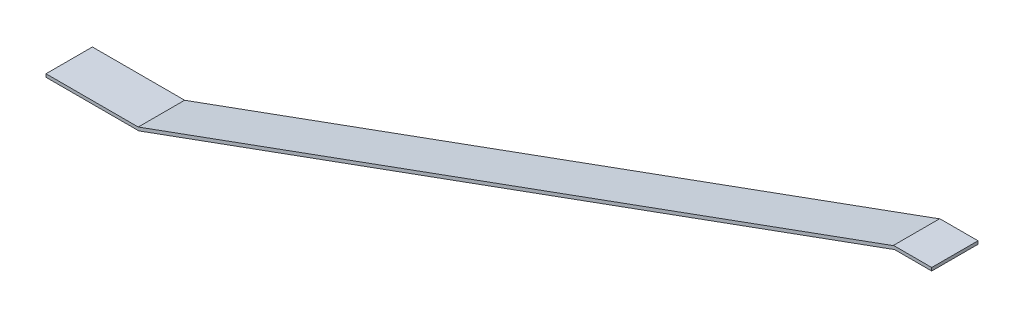
ISO-10303-21;
HEADER;
FILE_DESCRIPTION(('STEP AP214'),'2;1');
FILE_NAME('part.step','',(''),(''),'','','');
FILE_SCHEMA(('AUTOMOTIVE_DESIGN { 1 0 10303 214 1 1 1 1 }'));
ENDSEC;
DATA;
#1=APPLICATION_CONTEXT('core data for automotive mechanical design processes');
#2=APPLICATION_PROTOCOL_DEFINITION('international standard','automotive_design',2000,#1);
#3=PRODUCT_CONTEXT('',#1,'mechanical');
#4=PRODUCT('Part','Part','',(#3));
#5=PRODUCT_RELATED_PRODUCT_CATEGORY('part','',(#4));
#6=PRODUCT_DEFINITION_FORMATION('','',#4);
#7=PRODUCT_DEFINITION_CONTEXT('part definition',#1,'design');
#8=PRODUCT_DEFINITION('design','',#6,#7);
#9=PRODUCT_DEFINITION_SHAPE('','',#8);
#10=(LENGTH_UNIT() NAMED_UNIT(*) SI_UNIT(.MILLI.,.METRE.));
#11=(NAMED_UNIT(*) PLANE_ANGLE_UNIT() SI_UNIT($,.RADIAN.));
#12=(NAMED_UNIT(*) SI_UNIT($,.STERADIAN.) SOLID_ANGLE_UNIT());
#13=UNCERTAINTY_MEASURE_WITH_UNIT(LENGTH_MEASURE(1.E-05),#10,'distance_accuracy_value','');
#14=(GEOMETRIC_REPRESENTATION_CONTEXT(3) GLOBAL_UNCERTAINTY_ASSIGNED_CONTEXT((#13)) GLOBAL_UNIT_ASSIGNED_CONTEXT((#10,
#11,#12)) REPRESENTATION_CONTEXT('',''));
#15=CARTESIAN_POINT('',(0.,0.,0.));
#16=DIRECTION('',(0.,0.,1.));
#17=DIRECTION('',(1.,0.,0.));
#18=AXIS2_PLACEMENT_3D('',#15,#16,#17);
#19=CARTESIAN_POINT('',(273.978061261011,89.8649298854591,0.));
#20=DIRECTION('',(0.939692620785909,0.342020143325666,0.));
#21=DIRECTION('',(-0.342020143325666,0.939692620785909,0.));
#22=AXIS2_PLACEMENT_3D('',#19,#20,#21);
#23=PLANE('',#22);
#24=DIRECTION('',(0.,0.,1.));
#25=VECTOR('',#24,1.);
#26=CARTESIAN_POINT('',(273.978061261011,89.8649298854591,0.));
#27=LINE('',#26,#25);
#28=CARTESIAN_POINT('',(273.978061261011,89.8649298854591,-14.9803795202081));
#29=VERTEX_POINT('',#28);
#30=CARTESIAN_POINT('',(273.978061261011,89.8649298854591,-14.9584379809085));
#31=VERTEX_POINT('',#30);
#32=EDGE_CURVE('E186',#29,#31,#27,.T.);
#33=ORIENTED_EDGE('',*,*,#32,.T.);
#34=DIRECTION('',(0.342020143325666,-0.939692620785909,0.));
#35=VECTOR('',#34,1.);
#36=CARTESIAN_POINT('',(272.488807992052,93.9566196137723,-14.9584379809085));
#37=LINE('',#36,#35);
#38=CARTESIAN_POINT('',(274.320081404336,88.9252372646732,-14.9584379809085));
#39=VERTEX_POINT('',#38);
#40=EDGE_CURVE('E11',#31,#39,#37,.T.);
#41=ORIENTED_EDGE('',*,*,#40,.T.);
#42=DIRECTION('',(0.,0.,1.));
#43=VECTOR('',#42,1.);
#44=CARTESIAN_POINT('',(274.320081404336,88.9252372646732,0.));
#45=LINE('',#44,#43);
#46=CARTESIAN_POINT('',(274.320081404336,88.9252372646732,-14.9803795202081));
#47=VERTEX_POINT('',#46);
#48=EDGE_CURVE('E182',#47,#39,#45,.T.);
#49=ORIENTED_EDGE('',*,*,#48,.F.);
#50=DIRECTION('',(0.342020143325666,-0.939692620785909,0.));
#51=VECTOR('',#50,1.);
#52=CARTESIAN_POINT('',(273.978061261011,89.8649298854591,-14.9803795202081));
#53=LINE('',#52,#51);
#54=EDGE_CURVE('E190',#29,#47,#53,.T.);
#55=ORIENTED_EDGE('',*,*,#54,.F.);
#56=EDGE_LOOP('',(#33,#41,#49,#55));
#57=FACE_BOUND('',#56,.T.);
#58=ADVANCED_FACE('F39',(#57),#23,.T.);
#59=CARTESIAN_POINT('',(0.,1.,-15.));
#60=DIRECTION('',(0.,0.,-1.));
#61=DIRECTION('',(-1.,0.,0.));
#62=AXIS2_PLACEMENT_3D('',#59,#60,#61);
#63=PLANE('',#62);
#64=DIRECTION('',(1.,0.,0.));
#65=VECTOR('',#64,1.);
#66=CARTESIAN_POINT('',(0.,0.,-15.));
#67=LINE('',#66,#65);
#68=CARTESIAN_POINT('',(0.,0.,-15.));
#69=VERTEX_POINT('',#68);
#70=CARTESIAN_POINT('',(30.,0.,-15.));
#71=VERTEX_POINT('',#70);
#72=EDGE_CURVE('E210',#69,#71,#67,.T.);
#73=ORIENTED_EDGE('',*,*,#72,.F.);
#74=DIRECTION('',(0.,-1.,0.));
#75=VECTOR('',#74,1.);
#76=CARTESIAN_POINT('',(0.,1.,-15.));
#77=LINE('',#76,#75);
#78=CARTESIAN_POINT('',(0.,1.,-15.));
#79=VERTEX_POINT('',#78);
#80=EDGE_CURVE('E241',#79,#69,#77,.T.);
#81=ORIENTED_EDGE('',*,*,#80,.F.);
#82=DIRECTION('',(1.,0.,0.));
#83=VECTOR('',#82,1.);
#84=CARTESIAN_POINT('',(0.,1.,-15.));
#85=LINE('',#84,#83);
#86=CARTESIAN_POINT('',(30.,1.,-15.));
#87=VERTEX_POINT('',#86);
#88=EDGE_CURVE('E211',#79,#87,#85,.T.);
#89=ORIENTED_EDGE('',*,*,#88,.T.);
#90=DIRECTION('',(0.,-1.,0.));
#91=VECTOR('',#90,1.);
#92=CARTESIAN_POINT('',(30.,1.,-15.));
#93=LINE('',#92,#91);
#94=EDGE_CURVE('E226',#87,#71,#93,.T.);
#95=ORIENTED_EDGE('',*,*,#94,.T.);
#96=EDGE_LOOP('',(#73,#81,#89,#95));
#97=FACE_BOUND('',#96,.T.);
#98=ADVANCED_FACE('F41',(#97),#63,.T.);
#99=CARTESIAN_POINT('',(0.,1.,0.));
#100=DIRECTION('',(-1.,0.,0.));
#101=DIRECTION('',(0.,0.,1.));
#102=AXIS2_PLACEMENT_3D('',#99,#100,#101);
#103=PLANE('',#102);
#104=DIRECTION('',(0.,0.,-1.));
#105=VECTOR('',#104,1.);
#106=CARTESIAN_POINT('',(0.,0.,0.));
#107=LINE('',#106,#105);
#108=CARTESIAN_POINT('',(0.,0.,0.));
#109=VERTEX_POINT('',#108);
#110=EDGE_CURVE('E216',#109,#69,#107,.T.);
#111=ORIENTED_EDGE('',*,*,#110,.F.);
#112=DIRECTION('',(0.,-1.,0.));
#113=VECTOR('',#112,1.);
#114=CARTESIAN_POINT('',(0.,1.,0.));
#115=LINE('',#114,#113);
#116=CARTESIAN_POINT('',(0.,1.,0.));
#117=VERTEX_POINT('',#116);
#118=EDGE_CURVE('E244',#117,#109,#115,.T.);
#119=ORIENTED_EDGE('',*,*,#118,.F.);
#120=DIRECTION('',(0.,0.,-1.));
#121=VECTOR('',#120,1.);
#122=CARTESIAN_POINT('',(0.,1.,0.));
#123=LINE('',#122,#121);
#124=EDGE_CURVE('E222',#117,#79,#123,.T.);
#125=ORIENTED_EDGE('',*,*,#124,.T.);
#126=ORIENTED_EDGE('',*,*,#80,.T.);
#127=EDGE_LOOP('',(#111,#119,#125,#126));
#128=FACE_BOUND('',#127,.T.);
#129=ADVANCED_FACE('F260',(#128),#103,.T.);
#130=CARTESIAN_POINT('',(0.,1.,0.));
#131=DIRECTION('',(0.,0.,-1.));
#132=DIRECTION('',(-1.,0.,0.));
#133=AXIS2_PLACEMENT_3D('',#130,#131,#132);
#134=PLANE('',#133);
#135=DIRECTION('',(1.,0.,0.));
#136=VECTOR('',#135,1.);
#137=CARTESIAN_POINT('',(0.,0.,0.));
#138=LINE('',#137,#136);
#139=CARTESIAN_POINT('',(30.,0.,0.));
#140=VERTEX_POINT('',#139);
#141=EDGE_CURVE('E235',#109,#140,#138,.T.);
#142=ORIENTED_EDGE('',*,*,#141,.T.);
#143=DIRECTION('',(-0.939692620785909,-0.342020143325666,0.));
#144=VECTOR('',#143,1.);
#145=CARTESIAN_POINT('',(30.,0.,0.));
#146=LINE('',#145,#144);
#147=CARTESIAN_POINT('',(274.320081404336,88.9252372646731,0.));
#148=VERTEX_POINT('',#147);
#149=EDGE_CURVE('E168',#148,#140,#146,.T.);
#150=ORIENTED_EDGE('',*,*,#149,.F.);
#151=DIRECTION('',(-1.,0.,0.));
#152=VECTOR('',#151,1.);
#153=CARTESIAN_POINT('',(286.320081404336,88.9252372646731,0.));
#154=LINE('',#153,#152);
#155=CARTESIAN_POINT('',(286.320081404336,88.9252372646731,0.));
#156=VERTEX_POINT('',#155);
#157=EDGE_CURVE('E158',#156,#148,#154,.T.);
#158=ORIENTED_EDGE('',*,*,#157,.F.);
#159=DIRECTION('',(0.,1.,0.));
#160=VECTOR('',#159,1.);
#161=CARTESIAN_POINT('',(286.320081404336,88.9252372646731,0.));
#162=LINE('',#161,#160);
#163=CARTESIAN_POINT('',(286.320081404336,89.9252372646731,0.));
#164=VERTEX_POINT('',#163);
#165=EDGE_CURVE('E155',#156,#164,#162,.T.);
#166=ORIENTED_EDGE('',*,*,#165,.T.);
#167=DIRECTION('',(1.,0.,0.));
#168=VECTOR('',#167,1.);
#169=CARTESIAN_POINT('',(258.66519859926,89.9252372646732,0.));
#170=LINE('',#169,#168);
#171=CARTESIAN_POINT('',(273.95611117007,89.9252372646732,0.));
#172=VERTEX_POINT('',#171);
#173=EDGE_CURVE('E136',#172,#164,#170,.T.);
#174=ORIENTED_EDGE('',*,*,#173,.F.);
#175=DIRECTION('',(0.342020143325666,-0.939692620785909,0.));
#176=VECTOR('',#175,1.);
#177=CARTESIAN_POINT('',(272.488807992052,93.9566196137723,0.));
#178=LINE('',#177,#176);
#179=CARTESIAN_POINT('',(273.978061261011,89.8649298854591,0.));
#180=VERTEX_POINT('',#179);
#181=EDGE_CURVE('E164',#172,#180,#178,.T.);
#182=ORIENTED_EDGE('',*,*,#181,.T.);
#183=DIRECTION('',(-0.939692620785909,-0.342020143325666,0.));
#184=VECTOR('',#183,1.);
#185=CARTESIAN_POINT('',(29.6579798566743,0.93969262078591,0.));
#186=LINE('',#185,#184);
#187=CARTESIAN_POINT('',(29.8236730192915,1.,0.));
#188=VERTEX_POINT('',#187);
#189=EDGE_CURVE('E177',#180,#188,#186,.T.);
#190=ORIENTED_EDGE('',*,*,#189,.T.);
#191=DIRECTION('',(1.,0.,0.));
#192=VECTOR('',#191,1.);
#193=CARTESIAN_POINT('',(0.,1.,0.));
#194=LINE('',#193,#192);
#195=EDGE_CURVE('E219',#117,#188,#194,.T.);
#196=ORIENTED_EDGE('',*,*,#195,.F.);
#197=ORIENTED_EDGE('',*,*,#118,.T.);
#198=EDGE_LOOP('',(#142,#150,#158,#166,#174,#182,#190,#196,#197));
#199=FACE_BOUND('',#198,.T.);
#200=ADVANCED_FACE('F277',(#199),#134,.F.);
#201=CARTESIAN_POINT('',(30.,1.,0.));
#202=DIRECTION('',(-1.,0.,0.));
#203=DIRECTION('',(0.,0.,1.));
#204=AXIS2_PLACEMENT_3D('',#201,#202,#203);
#205=PLANE('',#204);
#206=DIRECTION('',(0.,0.,-1.));
#207=VECTOR('',#206,1.);
#208=CARTESIAN_POINT('',(30.,1.,0.));
#209=LINE('',#208,#207);
#210=CARTESIAN_POINT('',(30.,1.,-14.9803795202081));
#211=VERTEX_POINT('',#210);
#212=EDGE_CURVE('E215',#211,#87,#209,.T.);
#213=ORIENTED_EDGE('',*,*,#212,.F.);
#214=DIRECTION('',(0.,-1.,0.));
#215=VECTOR('',#214,1.);
#216=CARTESIAN_POINT('',(30.,1.,-14.9803795202081));
#217=LINE('',#216,#215);
#218=CARTESIAN_POINT('',(30.,0.,-14.9803795202081));
#219=VERTEX_POINT('',#218);
#220=EDGE_CURVE('E206',#211,#219,#217,.T.);
#221=ORIENTED_EDGE('',*,*,#220,.T.);
#222=DIRECTION('',(0.,0.,-1.));
#223=VECTOR('',#222,1.);
#224=CARTESIAN_POINT('',(30.,0.,0.));
#225=LINE('',#224,#223);
#226=EDGE_CURVE('E230',#219,#71,#225,.T.);
#227=ORIENTED_EDGE('',*,*,#226,.T.);
#228=ORIENTED_EDGE('',*,*,#94,.F.);
#229=EDGE_LOOP('',(#213,#221,#227,#228));
#230=FACE_BOUND('',#229,.T.);
#231=ADVANCED_FACE('F265',(#230),#205,.F.);
#232=CARTESIAN_POINT('',(0.,1.,0.));
#233=DIRECTION('',(0.,1.,0.));
#234=DIRECTION('',(0.,0.,1.));
#235=AXIS2_PLACEMENT_3D('',#232,#233,#234);
#236=PLANE('',#235);
#237=DIRECTION('',(-1.,0.,0.));
#238=VECTOR('',#237,1.);
#239=CARTESIAN_POINT('',(0.,1.,-14.9803795202081));
#240=LINE('',#239,#238);
#241=CARTESIAN_POINT('',(29.8236730192915,1.,-14.9803795202081));
#242=VERTEX_POINT('',#241);
#243=EDGE_CURVE('E203',#211,#242,#240,.T.);
#244=ORIENTED_EDGE('',*,*,#243,.F.);
#245=ORIENTED_EDGE('',*,*,#212,.T.);
#246=ORIENTED_EDGE('',*,*,#88,.F.);
#247=ORIENTED_EDGE('',*,*,#124,.F.);
#248=ORIENTED_EDGE('',*,*,#195,.T.);
#249=DIRECTION('',(0.,0.,1.));
#250=VECTOR('',#249,1.);
#251=CARTESIAN_POINT('',(29.8236730192915,1.,0.));
#252=LINE('',#251,#250);
#253=EDGE_CURVE('E43',#242,#188,#252,.T.);
#254=ORIENTED_EDGE('',*,*,#253,.F.);
#255=EDGE_LOOP('',(#244,#245,#246,#247,#248,#254));
#256=FACE_BOUND('',#255,.T.);
#257=ADVANCED_FACE('F263',(#256),#236,.T.);
#258=CARTESIAN_POINT('',(0.,0.,0.));
#259=DIRECTION('',(0.,1.,0.));
#260=DIRECTION('',(0.,0.,1.));
#261=AXIS2_PLACEMENT_3D('',#258,#259,#260);
#262=PLANE('',#261);
#263=ORIENTED_EDGE('',*,*,#72,.T.);
#264=ORIENTED_EDGE('',*,*,#226,.F.);
#265=EDGE_CURVE('E231',#140,#219,#225,.T.);
#266=ORIENTED_EDGE('',*,*,#265,.F.);
#267=ORIENTED_EDGE('',*,*,#141,.F.);
#268=ORIENTED_EDGE('',*,*,#110,.T.);
#269=EDGE_LOOP('',(#263,#264,#266,#267,#268));
#270=FACE_BOUND('',#269,.T.);
#271=ADVANCED_FACE('F255',(#270),#262,.F.);
#272=CARTESIAN_POINT('',(29.6579798566743,0.93969262078591,-14.9803795202081));
#273=DIRECTION('',(0.,0.,-1.));
#274=DIRECTION('',(-1.,0.,0.));
#275=AXIS2_PLACEMENT_3D('',#272,#273,#274);
#276=PLANE('',#275);
#277=ORIENTED_EDGE('',*,*,#220,.F.);
#278=ORIENTED_EDGE('',*,*,#243,.T.);
#279=DIRECTION('',(0.939692620785909,0.342020143325666,0.));
#280=VECTOR('',#279,1.);
#281=CARTESIAN_POINT('',(29.6579798566743,0.93969262078591,-14.9803795202081));
#282=LINE('',#281,#280);
#283=EDGE_CURVE('E181',#242,#29,#282,.T.);
#284=ORIENTED_EDGE('',*,*,#283,.T.);
#285=ORIENTED_EDGE('',*,*,#54,.T.);
#286=DIRECTION('',(0.939692620785909,0.342020143325666,0.));
#287=VECTOR('',#286,1.);
#288=CARTESIAN_POINT('',(30.,0.,-14.9803795202081));
#289=LINE('',#288,#287);
#290=EDGE_CURVE('E194',#219,#47,#289,.T.);
#291=ORIENTED_EDGE('',*,*,#290,.F.);
#292=EDGE_LOOP('',(#277,#278,#284,#285,#291));
#293=FACE_BOUND('',#292,.T.);
#294=ADVANCED_FACE('F268',(#293),#276,.T.);
#295=CARTESIAN_POINT('',(3.16731320988961,-8.70212152451211,0.));
#296=DIRECTION('',(-0.342020143325666,0.939692620785909,0.));
#297=DIRECTION('',(-0.939692620785909,-0.342020143325666,0.));
#298=AXIS2_PLACEMENT_3D('',#295,#296,#297);
#299=PLANE('',#298);
#300=ORIENTED_EDGE('',*,*,#283,.F.);
#301=ORIENTED_EDGE('',*,*,#253,.T.);
#302=ORIENTED_EDGE('',*,*,#189,.F.);
#303=EDGE_CURVE('E185',#31,#180,#27,.T.);
#304=ORIENTED_EDGE('',*,*,#303,.F.);
#305=ORIENTED_EDGE('',*,*,#32,.F.);
#306=EDGE_LOOP('',(#300,#301,#302,#304,#305));
#307=FACE_BOUND('',#306,.T.);
#308=ADVANCED_FACE('F280',(#307),#299,.T.);
#309=CARTESIAN_POINT('',(3.50933335321527,-9.64181414529802,0.));
#310=DIRECTION('',(-0.342020143325666,0.939692620785909,0.));
#311=DIRECTION('',(-0.939692620785909,-0.342020143325666,0.));
#312=AXIS2_PLACEMENT_3D('',#309,#310,#311);
#313=PLANE('',#312);
#314=ORIENTED_EDGE('',*,*,#149,.T.);
#315=ORIENTED_EDGE('',*,*,#265,.T.);
#316=ORIENTED_EDGE('',*,*,#290,.T.);
#317=ORIENTED_EDGE('',*,*,#48,.T.);
#318=DIRECTION('',(0.,0.,-1.));
#319=VECTOR('',#318,1.);
#320=CARTESIAN_POINT('',(274.320081404336,88.9252372646732,0.));
#321=LINE('',#320,#319);
#322=EDGE_CURVE('E161',#148,#39,#321,.T.);
#323=ORIENTED_EDGE('',*,*,#322,.F.);
#324=EDGE_LOOP('',(#314,#315,#316,#317,#323));
#325=FACE_BOUND('',#324,.T.);
#326=ADVANCED_FACE('F273',(#325),#313,.F.);
#327=CARTESIAN_POINT('',(273.978061261011,89.8649298854591,0.));
#328=DIRECTION('',(0.939692620785909,0.342020143325666,0.));
#329=DIRECTION('',(-0.342020143325666,0.939692620785909,0.));
#330=AXIS2_PLACEMENT_3D('',#327,#328,#329);
#331=PLANE('',#330);
#332=CARTESIAN_POINT('',(273.95611117007,89.9252372646732,-14.9584379809085));
#333=VERTEX_POINT('',#332);
#334=EDGE_CURVE('E50',#333,#31,#37,.T.);
#335=ORIENTED_EDGE('',*,*,#334,.T.);
#336=ORIENTED_EDGE('',*,*,#303,.T.);
#337=ORIENTED_EDGE('',*,*,#181,.F.);
#338=DIRECTION('',(0.,0.,1.));
#339=VECTOR('',#338,1.);
#340=CARTESIAN_POINT('',(273.95611117007,89.9252372646732,0.));
#341=LINE('',#340,#339);
#342=EDGE_CURVE('E169',#333,#172,#341,.T.);
#343=ORIENTED_EDGE('',*,*,#342,.F.);
#344=EDGE_LOOP('',(#335,#336,#337,#343));
#345=FACE_BOUND('',#344,.T.);
#346=ADVANCED_FACE('F286',(#345),#331,.F.);
#347=CARTESIAN_POINT('',(258.66519859926,88.9252372646732,-14.9584379809085));
#348=DIRECTION('',(0.,0.,-1.));
#349=DIRECTION('',(0.,1.,0.));
#350=AXIS2_PLACEMENT_3D('',#347,#348,#349);
#351=PLANE('',#350);
#352=ORIENTED_EDGE('',*,*,#334,.F.);
#353=DIRECTION('',(1.,0.,0.));
#354=VECTOR('',#353,1.);
#355=CARTESIAN_POINT('',(258.66519859926,89.9252372646732,-14.9584379809085));
#356=LINE('',#355,#354);
#357=CARTESIAN_POINT('',(286.320081404336,89.9252372646731,-14.9584379809085));
#358=VERTEX_POINT('',#357);
#359=EDGE_CURVE('E127',#333,#358,#356,.T.);
#360=ORIENTED_EDGE('',*,*,#359,.T.);
#361=DIRECTION('',(0.,1.,0.));
#362=VECTOR('',#361,1.);
#363=CARTESIAN_POINT('',(286.320081404336,88.9252372646731,-14.9584379809085));
#364=LINE('',#363,#362);
#365=CARTESIAN_POINT('',(286.320081404336,88.9252372646731,-14.9584379809085));
#366=VERTEX_POINT('',#365);
#367=EDGE_CURVE('E130',#366,#358,#364,.T.);
#368=ORIENTED_EDGE('',*,*,#367,.F.);
#369=DIRECTION('',(-1.,0.,0.));
#370=VECTOR('',#369,1.);
#371=CARTESIAN_POINT('',(286.320081404336,88.9252372646731,-14.9584379809085));
#372=LINE('',#371,#370);
#373=EDGE_CURVE('E57',#366,#39,#372,.T.);
#374=ORIENTED_EDGE('',*,*,#373,.T.);
#375=ORIENTED_EDGE('',*,*,#40,.F.);
#376=EDGE_LOOP('',(#352,#360,#368,#374,#375));
#377=FACE_BOUND('',#376,.T.);
#378=ADVANCED_FACE('F129',(#377),#351,.T.);
#379=CARTESIAN_POINT('',(258.66519859926,89.9252372646732,0.));
#380=DIRECTION('',(0.,-1.,0.));
#381=DIRECTION('',(1.,0.,0.));
#382=AXIS2_PLACEMENT_3D('',#379,#380,#381);
#383=PLANE('',#382);
#384=ORIENTED_EDGE('',*,*,#359,.F.);
#385=ORIENTED_EDGE('',*,*,#342,.T.);
#386=ORIENTED_EDGE('',*,*,#173,.T.);
#387=DIRECTION('',(0.,0.,-1.));
#388=VECTOR('',#387,1.);
#389=CARTESIAN_POINT('',(286.320081404336,89.9252372646731,0.));
#390=LINE('',#389,#388);
#391=EDGE_CURVE('E142',#164,#358,#390,.T.);
#392=ORIENTED_EDGE('',*,*,#391,.T.);
#393=EDGE_LOOP('',(#384,#385,#386,#392));
#394=FACE_BOUND('',#393,.T.);
#395=ADVANCED_FACE('F148',(#394),#383,.F.);
#396=CARTESIAN_POINT('',(286.320081404336,88.9252372646731,0.));
#397=DIRECTION('',(0.,1.,0.));
#398=DIRECTION('',(-1.,0.,0.));
#399=AXIS2_PLACEMENT_3D('',#396,#397,#398);
#400=PLANE('',#399);
#401=ORIENTED_EDGE('',*,*,#322,.T.);
#402=ORIENTED_EDGE('',*,*,#373,.F.);
#403=DIRECTION('',(0.,0.,-1.));
#404=VECTOR('',#403,1.);
#405=CARTESIAN_POINT('',(286.320081404336,88.9252372646731,0.));
#406=LINE('',#405,#404);
#407=EDGE_CURVE('E145',#156,#366,#406,.T.);
#408=ORIENTED_EDGE('',*,*,#407,.F.);
#409=ORIENTED_EDGE('',*,*,#157,.T.);
#410=EDGE_LOOP('',(#401,#402,#408,#409));
#411=FACE_BOUND('',#410,.T.);
#412=ADVANCED_FACE('F362',(#411),#400,.F.);
#413=CARTESIAN_POINT('',(286.320081404336,0.,0.));
#414=DIRECTION('',(1.,0.,0.));
#415=DIRECTION('',(0.,0.,-1.));
#416=AXIS2_PLACEMENT_3D('',#413,#414,#415);
#417=PLANE('',#416);
#418=ORIENTED_EDGE('',*,*,#391,.F.);
#419=ORIENTED_EDGE('',*,*,#165,.F.);
#420=ORIENTED_EDGE('',*,*,#407,.T.);
#421=ORIENTED_EDGE('',*,*,#367,.T.);
#422=EDGE_LOOP('',(#418,#419,#420,#421));
#423=FACE_BOUND('',#422,.T.);
#424=ADVANCED_FACE('F140',(#423),#417,.T.);
#425=CLOSED_SHELL('',(#58,#98,#129,#200,#231,#257,#271,#294,#308,#326,#346,#378,#395,#412,#424));
#426=MANIFOLD_SOLID_BREP('B2',#425);
#427=ADVANCED_BREP_SHAPE_REPRESENTATION('',(#18,#426),#14);
#428=SHAPE_DEFINITION_REPRESENTATION(#9,#427);
ENDSEC;
END-ISO-10303-21;
